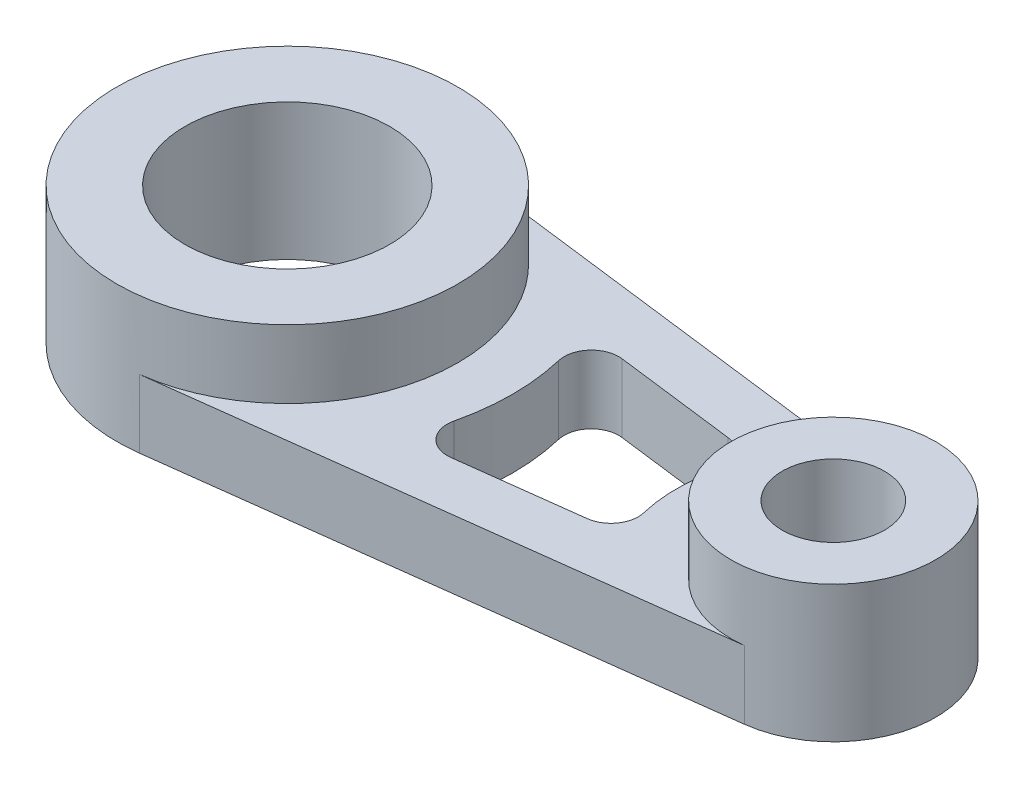
ISO-10303-21;
HEADER;
FILE_DESCRIPTION(('STEP AP214'),'2;1');
FILE_NAME('part.step','',(''),(''),'','','');
FILE_SCHEMA(('AUTOMOTIVE_DESIGN { 1 0 10303 214 1 1 1 1 }'));
ENDSEC;
DATA;
#1=APPLICATION_CONTEXT('core data for automotive mechanical design processes');
#2=APPLICATION_PROTOCOL_DEFINITION('international standard','automotive_design',2000,#1);
#3=PRODUCT_CONTEXT('',#1,'mechanical');
#4=PRODUCT('Part','Part','',(#3));
#5=PRODUCT_RELATED_PRODUCT_CATEGORY('part','',(#4));
#6=PRODUCT_DEFINITION_FORMATION('','',#4);
#7=PRODUCT_DEFINITION_CONTEXT('part definition',#1,'design');
#8=PRODUCT_DEFINITION('design','',#6,#7);
#9=PRODUCT_DEFINITION_SHAPE('','',#8);
#10=(LENGTH_UNIT() NAMED_UNIT(*) SI_UNIT(.MILLI.,.METRE.));
#11=(NAMED_UNIT(*) PLANE_ANGLE_UNIT() SI_UNIT($,.RADIAN.));
#12=(NAMED_UNIT(*) SI_UNIT($,.STERADIAN.) SOLID_ANGLE_UNIT());
#13=UNCERTAINTY_MEASURE_WITH_UNIT(LENGTH_MEASURE(1.E-05),#10,'distance_accuracy_value','');
#14=(GEOMETRIC_REPRESENTATION_CONTEXT(3) GLOBAL_UNCERTAINTY_ASSIGNED_CONTEXT((#13)) GLOBAL_UNIT_ASSIGNED_CONTEXT((#10,
#11,#12)) REPRESENTATION_CONTEXT('',''));
#15=CARTESIAN_POINT('',(0.,0.,0.));
#16=DIRECTION('',(0.,0.,1.));
#17=DIRECTION('',(1.,0.,0.));
#18=AXIS2_PLACEMENT_3D('',#15,#16,#17);
#19=CARTESIAN_POINT('',(0.,10.,0.));
#20=DIRECTION('',(0.,1.,0.));
#21=DIRECTION('',(0.,0.,1.));
#22=AXIS2_PLACEMENT_3D('',#19,#20,#21);
#23=PLANE('',#22);
#24=CARTESIAN_POINT('',(80.,10.,0.));
#25=DIRECTION('',(0.,-1.,0.));
#26=DIRECTION('',(0.,0.,1.));
#27=AXIS2_PLACEMENT_3D('',#24,#25,#26);
#28=CIRCLE('',#27,23.);
#29=CARTESIAN_POINT('',(57.6411386092293,10.,5.3927096443533));
#30=VERTEX_POINT('',#29);
#31=CARTESIAN_POINT('',(57.6411386092292,10.,-5.3927096443533));
#32=VERTEX_POINT('',#31);
#33=EDGE_CURVE('E60',#30,#32,#28,.T.);
#34=ORIENTED_EDGE('',*,*,#33,.F.);
#35=CARTESIAN_POINT('',(53.7526409760517,10.,6.33057219119735));
#36=DIRECTION('',(0.,1.,0.));
#37=DIRECTION('',(0.,0.,1.));
#38=AXIS2_PLACEMENT_3D('',#35,#36,#37);
#39=CIRCLE('',#38,4.);
#40=CARTESIAN_POINT('',(54.2526409760517,10.,10.2991991577942));
#41=VERTEX_POINT('',#40);
#42=EDGE_CURVE('E167',#41,#30,#39,.T.);
#43=ORIENTED_EDGE('',*,*,#42,.F.);
#44=DIRECTION('',(0.992156741649221,0.,-0.125));
#45=VECTOR('',#44,1.);
#46=CARTESIAN_POINT('',(36.4943177121688,10.,12.5365375891146));
#47=LINE('',#46,#45);
#48=CARTESIAN_POINT('',(36.4943177121688,10.,12.5365375891146));
#49=VERTEX_POINT('',#48);
#50=EDGE_CURVE('E164',#49,#41,#47,.T.);
#51=ORIENTED_EDGE('',*,*,#50,.F.);
#52=CARTESIAN_POINT('',(35.9943177121688,10.,8.56791062251768));
#53=DIRECTION('',(0.,1.,0.));
#54=DIRECTION('',(0.,0.,-1.));
#55=AXIS2_PLACEMENT_3D('',#52,#53,#54);
#56=CIRCLE('',#55,4.00000000000001);
#57=CARTESIAN_POINT('',(32.1030401216641,10.,7.64165001467793));
#58=VERTEX_POINT('',#57);
#59=EDGE_CURVE('E161',#58,#49,#56,.T.);
#60=ORIENTED_EDGE('',*,*,#59,.F.);
#61=CARTESIAN_POINT('',(0.,10.,0.));
#62=DIRECTION('',(0.,-1.,0.));
#63=DIRECTION('',(0.,0.,1.));
#64=AXIS2_PLACEMENT_3D('',#61,#62,#63);
#65=CIRCLE('',#64,33.);
#66=CARTESIAN_POINT('',(32.1030401216641,10.,-7.64165001467794));
#67=VERTEX_POINT('',#66);
#68=EDGE_CURVE('E155',#67,#58,#65,.T.);
#69=ORIENTED_EDGE('',*,*,#68,.F.);
#70=CARTESIAN_POINT('',(35.9943177121688,10.,-8.56791062251769));
#71=DIRECTION('',(0.,1.,0.));
#72=DIRECTION('',(0.,0.,1.));
#73=AXIS2_PLACEMENT_3D('',#70,#71,#72);
#74=CIRCLE('',#73,4.);
#75=CARTESIAN_POINT('',(36.4943177121688,10.,-12.5365375891146));
#76=VERTEX_POINT('',#75);
#77=EDGE_CURVE('E153',#76,#67,#74,.T.);
#78=ORIENTED_EDGE('',*,*,#77,.F.);
#79=DIRECTION('',(-0.992156741649221,0.,-0.125));
#80=VECTOR('',#79,1.);
#81=CARTESIAN_POINT('',(54.2526409760517,10.,-10.2991991577942));
#82=LINE('',#81,#80);
#83=CARTESIAN_POINT('',(54.2526409760517,10.,-10.2991991577942));
#84=VERTEX_POINT('',#83);
#85=EDGE_CURVE('E137',#84,#76,#82,.T.);
#86=ORIENTED_EDGE('',*,*,#85,.F.);
#87=CARTESIAN_POINT('',(53.7526409760517,10.,-6.33057219119735));
#88=DIRECTION('',(0.,1.,0.));
#89=DIRECTION('',(0.,0.,1.));
#90=AXIS2_PLACEMENT_3D('',#87,#88,#89);
#91=CIRCLE('',#90,4.);
#92=EDGE_CURVE('E146',#32,#84,#91,.T.);
#93=ORIENTED_EDGE('',*,*,#92,.F.);
#94=EDGE_LOOP('',(#34,#43,#51,#60,#69,#78,#86,#93));
#95=FACE_BOUND('',#94,.T.);
#96=DIRECTION('',(0.992156741649222,0.,-0.125));
#97=VECTOR('',#96,1.);
#98=CARTESIAN_POINT('',(3.125,10.,24.8039185412305));
#99=LINE('',#98,#97);
#100=CARTESIAN_POINT('',(3.125,10.,24.8039185412305));
#101=VERTEX_POINT('',#100);
#102=CARTESIAN_POINT('',(81.875,10.,14.8823511247383));
#103=VERTEX_POINT('',#102);
#104=EDGE_CURVE('E200',#101,#103,#99,.T.);
#105=ORIENTED_EDGE('',*,*,#104,.T.);
#106=CARTESIAN_POINT('',(80.,10.,0.));
#107=DIRECTION('',(0.,1.,0.));
#108=DIRECTION('',(0.,0.,1.));
#109=AXIS2_PLACEMENT_3D('',#106,#107,#108);
#110=CIRCLE('',#109,15.);
#111=CARTESIAN_POINT('',(81.875,10.,-14.8823511247383));
#112=VERTEX_POINT('',#111);
#113=EDGE_CURVE('E188',#103,#112,#110,.F.);
#114=ORIENTED_EDGE('',*,*,#113,.T.);
#115=DIRECTION('',(0.992156741649222,0.,0.125));
#116=VECTOR('',#115,1.);
#117=CARTESIAN_POINT('',(3.125,10.,-24.8039185412305));
#118=LINE('',#117,#116);
#119=CARTESIAN_POINT('',(3.125,10.,-24.8039185412305));
#120=VERTEX_POINT('',#119);
#121=EDGE_CURVE('E203',#120,#112,#118,.T.);
#122=ORIENTED_EDGE('',*,*,#121,.F.);
#123=CARTESIAN_POINT('',(0.,10.,0.));
#124=DIRECTION('',(0.,1.,0.));
#125=DIRECTION('',(0.,0.,1.));
#126=AXIS2_PLACEMENT_3D('',#123,#124,#125);
#127=CIRCLE('',#126,25.);
#128=EDGE_CURVE('E196',#120,#101,#127,.F.);
#129=ORIENTED_EDGE('',*,*,#128,.T.);
#130=EDGE_LOOP('',(#105,#114,#122,#129));
#131=FACE_BOUND('',#130,.T.);
#132=ADVANCED_FACE('F45',(#95,#131),#23,.T.);
#133=CARTESIAN_POINT('',(0.,10.,0.));
#134=DIRECTION('',(0.,-1.,0.));
#135=DIRECTION('',(0.,0.,-1.));
#136=AXIS2_PLACEMENT_3D('',#133,#134,#135);
#137=CYLINDRICAL_SURFACE('',#136,25.);
#138=CARTESIAN_POINT('',(0.,0.,0.));
#139=DIRECTION('',(0.,1.,0.));
#140=DIRECTION('',(0.,0.,1.));
#141=AXIS2_PLACEMENT_3D('',#138,#139,#140);
#142=CIRCLE('',#141,25.);
#143=CARTESIAN_POINT('',(3.125,0.,-24.8039185412305));
#144=VERTEX_POINT('',#143);
#145=CARTESIAN_POINT('',(3.125,0.,24.8039185412305));
#146=VERTEX_POINT('',#145);
#147=EDGE_CURVE('E210',#144,#146,#142,.T.);
#148=ORIENTED_EDGE('',*,*,#147,.T.);
#149=DIRECTION('',(0.,-1.,0.));
#150=VECTOR('',#149,1.);
#151=CARTESIAN_POINT('',(3.125,10.,24.8039185412305));
#152=LINE('',#151,#150);
#153=EDGE_CURVE('E229',#101,#146,#152,.T.);
#154=ORIENTED_EDGE('',*,*,#153,.F.);
#155=ORIENTED_EDGE('',*,*,#128,.F.);
#156=DIRECTION('',(0.,-1.,0.));
#157=VECTOR('',#156,1.);
#158=CARTESIAN_POINT('',(3.125,10.,-24.8039185412305));
#159=LINE('',#158,#157);
#160=EDGE_CURVE('E207',#120,#144,#159,.T.);
#161=ORIENTED_EDGE('',*,*,#160,.T.);
#162=EDGE_LOOP('',(#148,#154,#155,#161));
#163=FACE_BOUND('',#162,.T.);
#164=CARTESIAN_POINT('',(0.,20.,0.));
#165=DIRECTION('',(0.,1.,0.));
#166=DIRECTION('',(0.,0.,1.));
#167=AXIS2_PLACEMENT_3D('',#164,#165,#166);
#168=CIRCLE('',#167,25.);
#169=CARTESIAN_POINT('',(0.,20.,25.));
#170=VERTEX_POINT('',#169);
#171=EDGE_CURVE('E193',#170,#170,#168,.T.);
#172=ORIENTED_EDGE('',*,*,#171,.F.);
#173=EDGE_LOOP('',(#172));
#174=FACE_BOUND('',#173,.T.);
#175=ADVANCED_FACE('F282',(#163,#174),#137,.T.);
#176=CARTESIAN_POINT('',(3.125,10.,24.8039185412305));
#177=DIRECTION('',(-0.125,0.,-0.992156741649222));
#178=DIRECTION('',(-0.992156741649222,0.,0.125));
#179=AXIS2_PLACEMENT_3D('',#176,#177,#178);
#180=PLANE('',#179);
#181=DIRECTION('',(0.992156741649222,0.,-0.125));
#182=VECTOR('',#181,1.);
#183=CARTESIAN_POINT('',(3.125,0.,24.8039185412305));
#184=LINE('',#183,#182);
#185=CARTESIAN_POINT('',(81.875,0.,14.8823511247383));
#186=VERTEX_POINT('',#185);
#187=EDGE_CURVE('E213',#146,#186,#184,.T.);
#188=ORIENTED_EDGE('',*,*,#187,.T.);
#189=DIRECTION('',(0.,-1.,0.));
#190=VECTOR('',#189,1.);
#191=CARTESIAN_POINT('',(81.875,10.,14.8823511247383));
#192=LINE('',#191,#190);
#193=EDGE_CURVE('E226',#103,#186,#192,.T.);
#194=ORIENTED_EDGE('',*,*,#193,.F.);
#195=ORIENTED_EDGE('',*,*,#104,.F.);
#196=ORIENTED_EDGE('',*,*,#153,.T.);
#197=EDGE_LOOP('',(#188,#194,#195,#196));
#198=FACE_BOUND('',#197,.T.);
#199=ADVANCED_FACE('F287',(#198),#180,.F.);
#200=CARTESIAN_POINT('',(80.,10.,0.));
#201=DIRECTION('',(0.,-1.,0.));
#202=DIRECTION('',(0.,0.,-1.));
#203=AXIS2_PLACEMENT_3D('',#200,#201,#202);
#204=CYLINDRICAL_SURFACE('',#203,15.);
#205=CARTESIAN_POINT('',(80.,0.,0.));
#206=DIRECTION('',(0.,1.,0.));
#207=DIRECTION('',(0.,0.,1.));
#208=AXIS2_PLACEMENT_3D('',#205,#206,#207);
#209=CIRCLE('',#208,15.);
#210=CARTESIAN_POINT('',(81.875,0.,-14.8823511247383));
#211=VERTEX_POINT('',#210);
#212=EDGE_CURVE('E215',#186,#211,#209,.T.);
#213=ORIENTED_EDGE('',*,*,#212,.T.);
#214=DIRECTION('',(0.,-1.,0.));
#215=VECTOR('',#214,1.);
#216=CARTESIAN_POINT('',(81.875,10.,-14.8823511247383));
#217=LINE('',#216,#215);
#218=EDGE_CURVE('E224',#112,#211,#217,.T.);
#219=ORIENTED_EDGE('',*,*,#218,.F.);
#220=ORIENTED_EDGE('',*,*,#113,.F.);
#221=ORIENTED_EDGE('',*,*,#193,.T.);
#222=EDGE_LOOP('',(#213,#219,#220,#221));
#223=FACE_BOUND('',#222,.T.);
#224=CARTESIAN_POINT('',(80.,20.,0.));
#225=DIRECTION('',(0.,1.,0.));
#226=DIRECTION('',(0.,0.,1.));
#227=AXIS2_PLACEMENT_3D('',#224,#225,#226);
#228=CIRCLE('',#227,15.);
#229=CARTESIAN_POINT('',(80.,20.,15.));
#230=VERTEX_POINT('',#229);
#231=EDGE_CURVE('E185',#230,#230,#228,.T.);
#232=ORIENTED_EDGE('',*,*,#231,.F.);
#233=EDGE_LOOP('',(#232));
#234=FACE_BOUND('',#233,.T.);
#235=ADVANCED_FACE('F300',(#223,#234),#204,.T.);
#236=CARTESIAN_POINT('',(3.125,10.,-24.8039185412305));
#237=DIRECTION('',(0.125,0.,-0.992156741649222));
#238=DIRECTION('',(-0.992156741649222,0.,-0.125));
#239=AXIS2_PLACEMENT_3D('',#236,#237,#238);
#240=PLANE('',#239);
#241=DIRECTION('',(0.992156741649222,0.,0.125));
#242=VECTOR('',#241,1.);
#243=CARTESIAN_POINT('',(3.125,0.,-24.8039185412305));
#244=LINE('',#243,#242);
#245=EDGE_CURVE('E218',#144,#211,#244,.T.);
#246=ORIENTED_EDGE('',*,*,#245,.F.);
#247=ORIENTED_EDGE('',*,*,#160,.F.);
#248=ORIENTED_EDGE('',*,*,#121,.T.);
#249=ORIENTED_EDGE('',*,*,#218,.T.);
#250=EDGE_LOOP('',(#246,#247,#248,#249));
#251=FACE_BOUND('',#250,.T.);
#252=ADVANCED_FACE('F297',(#251),#240,.T.);
#253=CARTESIAN_POINT('',(0.,10.,0.));
#254=DIRECTION('',(0.,-1.,0.));
#255=DIRECTION('',(0.,0.,-1.));
#256=AXIS2_PLACEMENT_3D('',#253,#254,#255);
#257=CYLINDRICAL_SURFACE('',#256,15.);
#258=CARTESIAN_POINT('',(0.,0.,0.));
#259=DIRECTION('',(0.,1.,0.));
#260=DIRECTION('',(0.,0.,1.));
#261=AXIS2_PLACEMENT_3D('',#258,#259,#260);
#262=CIRCLE('',#261,15.);
#263=CARTESIAN_POINT('',(0.,0.,15.));
#264=VERTEX_POINT('',#263);
#265=EDGE_CURVE('E199',#264,#264,#262,.T.);
#266=ORIENTED_EDGE('',*,*,#265,.F.);
#267=EDGE_LOOP('',(#266));
#268=FACE_BOUND('',#267,.T.);
#269=CARTESIAN_POINT('',(0.,20.,0.));
#270=DIRECTION('',(0.,1.,0.));
#271=DIRECTION('',(0.,0.,1.));
#272=AXIS2_PLACEMENT_3D('',#269,#270,#271);
#273=CIRCLE('',#272,15.);
#274=CARTESIAN_POINT('',(0.,20.,15.));
#275=VERTEX_POINT('',#274);
#276=EDGE_CURVE('E190',#275,#275,#273,.T.);
#277=ORIENTED_EDGE('',*,*,#276,.T.);
#278=EDGE_LOOP('',(#277));
#279=FACE_BOUND('',#278,.T.);
#280=ADVANCED_FACE('F47',(#268,#279),#257,.F.);
#281=CARTESIAN_POINT('',(80.,10.,0.));
#282=DIRECTION('',(0.,-1.,0.));
#283=DIRECTION('',(0.,0.,-1.));
#284=AXIS2_PLACEMENT_3D('',#281,#282,#283);
#285=CYLINDRICAL_SURFACE('',#284,7.5);
#286=CARTESIAN_POINT('',(80.,0.,0.));
#287=DIRECTION('',(0.,1.,0.));
#288=DIRECTION('',(0.,0.,1.));
#289=AXIS2_PLACEMENT_3D('',#286,#287,#288);
#290=CIRCLE('',#289,7.5);
#291=CARTESIAN_POINT('',(80.,0.,7.5));
#292=VERTEX_POINT('',#291);
#293=EDGE_CURVE('E204',#292,#292,#290,.T.);
#294=ORIENTED_EDGE('',*,*,#293,.F.);
#295=EDGE_LOOP('',(#294));
#296=FACE_BOUND('',#295,.T.);
#297=CARTESIAN_POINT('',(80.,20.,0.));
#298=DIRECTION('',(0.,1.,0.));
#299=DIRECTION('',(0.,0.,1.));
#300=AXIS2_PLACEMENT_3D('',#297,#298,#299);
#301=CIRCLE('',#300,7.5);
#302=CARTESIAN_POINT('',(80.,20.,7.5));
#303=VERTEX_POINT('',#302);
#304=EDGE_CURVE('E172',#303,#303,#301,.T.);
#305=ORIENTED_EDGE('',*,*,#304,.T.);
#306=EDGE_LOOP('',(#305));
#307=FACE_BOUND('',#306,.T.);
#308=ADVANCED_FACE('F293',(#296,#307),#285,.F.);
#309=CARTESIAN_POINT('',(0.,0.,0.));
#310=DIRECTION('',(0.,1.,0.));
#311=DIRECTION('',(0.,0.,1.));
#312=AXIS2_PLACEMENT_3D('',#309,#310,#311);
#313=PLANE('',#312);
#314=CARTESIAN_POINT('',(53.7526409760517,0.,6.33057219119735));
#315=DIRECTION('',(0.,1.,0.));
#316=DIRECTION('',(0.,0.,1.));
#317=AXIS2_PLACEMENT_3D('',#314,#315,#316);
#318=CIRCLE('',#317,4.);
#319=CARTESIAN_POINT('',(54.2526409760517,0.,10.2991991577942));
#320=VERTEX_POINT('',#319);
#321=CARTESIAN_POINT('',(57.6411386092293,0.,5.3927096443533));
#322=VERTEX_POINT('',#321);
#323=EDGE_CURVE('E53',#320,#322,#318,.T.);
#324=ORIENTED_EDGE('',*,*,#323,.T.);
#325=CARTESIAN_POINT('',(80.,0.,0.));
#326=DIRECTION('',(0.,1.,0.));
#327=DIRECTION('',(0.,0.,1.));
#328=AXIS2_PLACEMENT_3D('',#325,#326,#327);
#329=CIRCLE('',#328,23.);
#330=CARTESIAN_POINT('',(57.6411386092292,0.,-5.3927096443533));
#331=VERTEX_POINT('',#330);
#332=EDGE_CURVE('E13',#322,#331,#329,.F.);
#333=ORIENTED_EDGE('',*,*,#332,.T.);
#334=CARTESIAN_POINT('',(53.7526409760517,0.,-6.33057219119735));
#335=DIRECTION('',(0.,1.,0.));
#336=DIRECTION('',(0.,0.,1.));
#337=AXIS2_PLACEMENT_3D('',#334,#335,#336);
#338=CIRCLE('',#337,4.);
#339=CARTESIAN_POINT('',(54.2526409760517,0.,-10.2991991577942));
#340=VERTEX_POINT('',#339);
#341=EDGE_CURVE('E232',#331,#340,#338,.T.);
#342=ORIENTED_EDGE('',*,*,#341,.T.);
#343=DIRECTION('',(-0.992156741649222,0.,-0.125));
#344=VECTOR('',#343,1.);
#345=CARTESIAN_POINT('',(2.125,0.,-16.8666646080368));
#346=LINE('',#345,#344);
#347=CARTESIAN_POINT('',(36.4943177121688,0.,-12.5365375891146));
#348=VERTEX_POINT('',#347);
#349=EDGE_CURVE('E140',#340,#348,#346,.T.);
#350=ORIENTED_EDGE('',*,*,#349,.T.);
#351=CARTESIAN_POINT('',(35.9943177121688,0.,-8.56791062251769));
#352=DIRECTION('',(0.,1.,0.));
#353=DIRECTION('',(0.,0.,1.));
#354=AXIS2_PLACEMENT_3D('',#351,#352,#353);
#355=CIRCLE('',#354,4.);
#356=CARTESIAN_POINT('',(32.1030401216641,0.,-7.64165001467794));
#357=VERTEX_POINT('',#356);
#358=EDGE_CURVE('E235',#348,#357,#355,.T.);
#359=ORIENTED_EDGE('',*,*,#358,.T.);
#360=CARTESIAN_POINT('',(0.,0.,0.));
#361=DIRECTION('',(0.,1.,0.));
#362=DIRECTION('',(0.,0.,1.));
#363=AXIS2_PLACEMENT_3D('',#360,#361,#362);
#364=CIRCLE('',#363,33.);
#365=CARTESIAN_POINT('',(32.1030401216641,0.,7.64165001467793));
#366=VERTEX_POINT('',#365);
#367=EDGE_CURVE('E238',#357,#366,#364,.F.);
#368=ORIENTED_EDGE('',*,*,#367,.T.);
#369=CARTESIAN_POINT('',(35.9943177121688,0.,8.56791062251768));
#370=DIRECTION('',(0.,1.,0.));
#371=DIRECTION('',(0.,0.,1.));
#372=AXIS2_PLACEMENT_3D('',#369,#370,#371);
#373=CIRCLE('',#372,4.00000000000001);
#374=CARTESIAN_POINT('',(36.4943177121688,0.,12.5365375891146));
#375=VERTEX_POINT('',#374);
#376=EDGE_CURVE('E241',#366,#375,#373,.T.);
#377=ORIENTED_EDGE('',*,*,#376,.T.);
#378=DIRECTION('',(0.992156741649222,0.,-0.125));
#379=VECTOR('',#378,1.);
#380=CARTESIAN_POINT('',(2.125,0.,16.8666646080368));
#381=LINE('',#380,#379);
#382=EDGE_CURVE('E244',#375,#320,#381,.T.);
#383=ORIENTED_EDGE('',*,*,#382,.T.);
#384=EDGE_LOOP('',(#324,#333,#342,#350,#359,#368,#377,#383));
#385=FACE_BOUND('',#384,.T.);
#386=ORIENTED_EDGE('',*,*,#245,.T.);
#387=ORIENTED_EDGE('',*,*,#212,.F.);
#388=ORIENTED_EDGE('',*,*,#187,.F.);
#389=ORIENTED_EDGE('',*,*,#147,.F.);
#390=EDGE_LOOP('',(#386,#387,#388,#389));
#391=FACE_BOUND('',#390,.T.);
#392=ORIENTED_EDGE('',*,*,#265,.T.);
#393=EDGE_LOOP('',(#392));
#394=FACE_BOUND('',#393,.T.);
#395=ORIENTED_EDGE('',*,*,#293,.T.);
#396=EDGE_LOOP('',(#395));
#397=FACE_BOUND('',#396,.T.);
#398=ADVANCED_FACE('F248',(#385,#391,#394,#397),#313,.F.);
#399=CARTESIAN_POINT('',(0.,20.,0.));
#400=DIRECTION('',(0.,1.,0.));
#401=DIRECTION('',(0.,0.,1.));
#402=AXIS2_PLACEMENT_3D('',#399,#400,#401);
#403=PLANE('',#402);
#404=ORIENTED_EDGE('',*,*,#276,.F.);
#405=EDGE_LOOP('',(#404));
#406=FACE_BOUND('',#405,.T.);
#407=ORIENTED_EDGE('',*,*,#171,.T.);
#408=EDGE_LOOP('',(#407));
#409=FACE_BOUND('',#408,.T.);
#410=ADVANCED_FACE('F277',(#406,#409),#403,.T.);
#411=CARTESIAN_POINT('',(0.,20.,0.));
#412=DIRECTION('',(0.,1.,0.));
#413=DIRECTION('',(0.,0.,1.));
#414=AXIS2_PLACEMENT_3D('',#411,#412,#413);
#415=PLANE('',#414);
#416=ORIENTED_EDGE('',*,*,#304,.F.);
#417=EDGE_LOOP('',(#416));
#418=FACE_BOUND('',#417,.T.);
#419=ORIENTED_EDGE('',*,*,#231,.T.);
#420=EDGE_LOOP('',(#419));
#421=FACE_BOUND('',#420,.T.);
#422=ADVANCED_FACE('F270',(#418,#421),#415,.T.);
#423=CARTESIAN_POINT('',(80.,-10.,0.));
#424=DIRECTION('',(0.,1.,0.));
#425=DIRECTION('',(0.,0.,1.));
#426=AXIS2_PLACEMENT_3D('',#423,#424,#425);
#427=CYLINDRICAL_SURFACE('',#426,23.);
#428=DIRECTION('',(0.,1.,0.));
#429=VECTOR('',#428,1.);
#430=CARTESIAN_POINT('',(57.6411386092293,-10.,5.3927096443533));
#431=LINE('',#430,#429);
#432=EDGE_CURVE('E170',#322,#30,#431,.T.);
#433=ORIENTED_EDGE('',*,*,#432,.T.);
#434=ORIENTED_EDGE('',*,*,#33,.T.);
#435=DIRECTION('',(0.,1.,0.));
#436=VECTOR('',#435,1.);
#437=CARTESIAN_POINT('',(57.6411386092292,-10.,-5.3927096443533));
#438=LINE('',#437,#436);
#439=EDGE_CURVE('E143',#331,#32,#438,.T.);
#440=ORIENTED_EDGE('',*,*,#439,.F.);
#441=ORIENTED_EDGE('',*,*,#332,.F.);
#442=EDGE_LOOP('',(#433,#434,#440,#441));
#443=FACE_BOUND('',#442,.T.);
#444=ADVANCED_FACE('F268',(#443),#427,.T.);
#445=CARTESIAN_POINT('',(53.7526409760517,-10.,6.33057219119735));
#446=DIRECTION('',(0.,1.,0.));
#447=DIRECTION('',(0.,0.,1.));
#448=AXIS2_PLACEMENT_3D('',#445,#446,#447);
#449=CYLINDRICAL_SURFACE('',#448,4.);
#450=DIRECTION('',(0.,1.,0.));
#451=VECTOR('',#450,1.);
#452=CARTESIAN_POINT('',(54.2526409760517,-10.,10.2991991577942));
#453=LINE('',#452,#451);
#454=EDGE_CURVE('E173',#320,#41,#453,.T.);
#455=ORIENTED_EDGE('',*,*,#454,.T.);
#456=ORIENTED_EDGE('',*,*,#42,.T.);
#457=ORIENTED_EDGE('',*,*,#432,.F.);
#458=ORIENTED_EDGE('',*,*,#323,.F.);
#459=EDGE_LOOP('',(#455,#456,#457,#458));
#460=FACE_BOUND('',#459,.T.);
#461=ADVANCED_FACE('F253',(#460),#449,.F.);
#462=CARTESIAN_POINT('',(36.4943177121688,-10.,12.5365375891146));
#463=DIRECTION('',(0.125,0.,0.992156741649222));
#464=DIRECTION('',(0.992156741649222,0.,-0.125));
#465=AXIS2_PLACEMENT_3D('',#462,#463,#464);
#466=PLANE('',#465);
#467=DIRECTION('',(0.,1.,0.));
#468=VECTOR('',#467,1.);
#469=CARTESIAN_POINT('',(36.4943177121688,-10.,12.5365375891146));
#470=LINE('',#469,#468);
#471=EDGE_CURVE('E175',#375,#49,#470,.T.);
#472=ORIENTED_EDGE('',*,*,#471,.T.);
#473=ORIENTED_EDGE('',*,*,#50,.T.);
#474=ORIENTED_EDGE('',*,*,#454,.F.);
#475=ORIENTED_EDGE('',*,*,#382,.F.);
#476=EDGE_LOOP('',(#472,#473,#474,#475));
#477=FACE_BOUND('',#476,.T.);
#478=ADVANCED_FACE('F255',(#477),#466,.F.);
#479=CARTESIAN_POINT('',(35.9943177121688,-10.,8.56791062251768));
#480=DIRECTION('',(0.,1.,0.));
#481=DIRECTION('',(0.,0.,1.));
#482=AXIS2_PLACEMENT_3D('',#479,#480,#481);
#483=CYLINDRICAL_SURFACE('',#482,4.00000000000001);
#484=DIRECTION('',(0.,1.,0.));
#485=VECTOR('',#484,1.);
#486=CARTESIAN_POINT('',(32.1030401216641,-10.,7.64165001467793));
#487=LINE('',#486,#485);
#488=EDGE_CURVE('E177',#366,#58,#487,.T.);
#489=ORIENTED_EDGE('',*,*,#488,.T.);
#490=ORIENTED_EDGE('',*,*,#59,.T.);
#491=ORIENTED_EDGE('',*,*,#471,.F.);
#492=ORIENTED_EDGE('',*,*,#376,.F.);
#493=EDGE_LOOP('',(#489,#490,#491,#492));
#494=FACE_BOUND('',#493,.T.);
#495=ADVANCED_FACE('F261',(#494),#483,.F.);
#496=CARTESIAN_POINT('',(0.,-10.,0.));
#497=DIRECTION('',(0.,1.,0.));
#498=DIRECTION('',(0.,0.,1.));
#499=AXIS2_PLACEMENT_3D('',#496,#497,#498);
#500=CYLINDRICAL_SURFACE('',#499,33.);
#501=DIRECTION('',(0.,1.,0.));
#502=VECTOR('',#501,1.);
#503=CARTESIAN_POINT('',(32.1030401216641,-10.,-7.64165001467794));
#504=LINE('',#503,#502);
#505=EDGE_CURVE('E179',#357,#67,#504,.T.);
#506=ORIENTED_EDGE('',*,*,#505,.T.);
#507=ORIENTED_EDGE('',*,*,#68,.T.);
#508=ORIENTED_EDGE('',*,*,#488,.F.);
#509=ORIENTED_EDGE('',*,*,#367,.F.);
#510=EDGE_LOOP('',(#506,#507,#508,#509));
#511=FACE_BOUND('',#510,.T.);
#512=ADVANCED_FACE('F264',(#511),#500,.T.);
#513=CARTESIAN_POINT('',(35.9943177121688,-10.,-8.56791062251769));
#514=DIRECTION('',(0.,1.,0.));
#515=DIRECTION('',(0.,0.,1.));
#516=AXIS2_PLACEMENT_3D('',#513,#514,#515);
#517=CYLINDRICAL_SURFACE('',#516,4.);
#518=DIRECTION('',(0.,1.,0.));
#519=VECTOR('',#518,1.);
#520=CARTESIAN_POINT('',(36.4943177121688,-10.,-12.5365375891146));
#521=LINE('',#520,#519);
#522=EDGE_CURVE('E142',#348,#76,#521,.T.);
#523=ORIENTED_EDGE('',*,*,#522,.T.);
#524=ORIENTED_EDGE('',*,*,#77,.T.);
#525=ORIENTED_EDGE('',*,*,#505,.F.);
#526=ORIENTED_EDGE('',*,*,#358,.F.);
#527=EDGE_LOOP('',(#523,#524,#525,#526));
#528=FACE_BOUND('',#527,.T.);
#529=ADVANCED_FACE('F267',(#528),#517,.F.);
#530=CARTESIAN_POINT('',(54.2526409760517,-10.,-10.2991991577942));
#531=DIRECTION('',(0.125,0.,-0.992156741649222));
#532=DIRECTION('',(-0.992156741649222,0.,-0.125));
#533=AXIS2_PLACEMENT_3D('',#530,#531,#532);
#534=PLANE('',#533);
#535=DIRECTION('',(0.,1.,0.));
#536=VECTOR('',#535,1.);
#537=CARTESIAN_POINT('',(54.2526409760517,-10.,-10.2991991577942));
#538=LINE('',#537,#536);
#539=EDGE_CURVE('E68',#340,#84,#538,.T.);
#540=ORIENTED_EDGE('',*,*,#539,.T.);
#541=ORIENTED_EDGE('',*,*,#85,.T.);
#542=ORIENTED_EDGE('',*,*,#522,.F.);
#543=ORIENTED_EDGE('',*,*,#349,.F.);
#544=EDGE_LOOP('',(#540,#541,#542,#543));
#545=FACE_BOUND('',#544,.T.);
#546=ADVANCED_FACE('F134',(#545),#534,.F.);
#547=CARTESIAN_POINT('',(53.7526409760517,-10.,-6.33057219119735));
#548=DIRECTION('',(0.,1.,0.));
#549=DIRECTION('',(0.,0.,1.));
#550=AXIS2_PLACEMENT_3D('',#547,#548,#549);
#551=CYLINDRICAL_SURFACE('',#550,4.);
#552=ORIENTED_EDGE('',*,*,#439,.T.);
#553=ORIENTED_EDGE('',*,*,#92,.T.);
#554=ORIENTED_EDGE('',*,*,#539,.F.);
#555=ORIENTED_EDGE('',*,*,#341,.F.);
#556=EDGE_LOOP('',(#552,#553,#554,#555));
#557=FACE_BOUND('',#556,.T.);
#558=ADVANCED_FACE('F147',(#557),#551,.F.);
#559=CLOSED_SHELL('',(#132,#175,#199,#235,#252,#280,#308,#398,#410,#422,#444,#461,#478,#495,
#512,#529,#546,#558));
#560=MANIFOLD_SOLID_BREP('B2',#559);
#561=ADVANCED_BREP_SHAPE_REPRESENTATION('',(#18,#560),#14);
#562=SHAPE_DEFINITION_REPRESENTATION(#9,#561);
ENDSEC;
END-ISO-10303-21;
